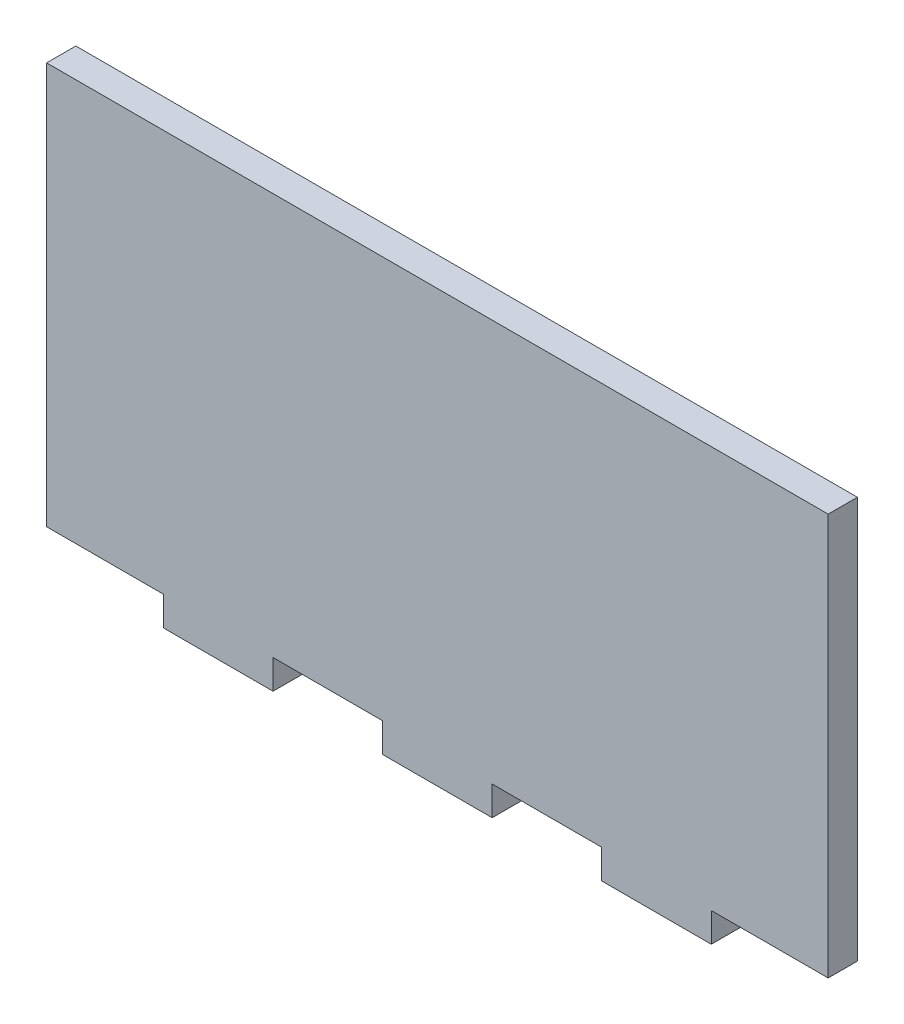
ISO-10303-21;
HEADER;
FILE_DESCRIPTION(('STEP AP214'),'2;1');
FILE_NAME('part.step','',(''),(''),'','','');
FILE_SCHEMA(('AUTOMOTIVE_DESIGN { 1 0 10303 214 1 1 1 1 }'));
ENDSEC;
DATA;
#1=APPLICATION_CONTEXT('core data for automotive mechanical design processes');
#2=APPLICATION_PROTOCOL_DEFINITION('international standard','automotive_design',2000,#1);
#3=PRODUCT_CONTEXT('',#1,'mechanical');
#4=PRODUCT('Part','Part','',(#3));
#5=PRODUCT_RELATED_PRODUCT_CATEGORY('part','',(#4));
#6=PRODUCT_DEFINITION_FORMATION('','',#4);
#7=PRODUCT_DEFINITION_CONTEXT('part definition',#1,'design');
#8=PRODUCT_DEFINITION('design','',#6,#7);
#9=PRODUCT_DEFINITION_SHAPE('','',#8);
#10=(LENGTH_UNIT() NAMED_UNIT(*) SI_UNIT(.MILLI.,.METRE.));
#11=(NAMED_UNIT(*) PLANE_ANGLE_UNIT() SI_UNIT($,.RADIAN.));
#12=(NAMED_UNIT(*) SI_UNIT($,.STERADIAN.) SOLID_ANGLE_UNIT());
#13=UNCERTAINTY_MEASURE_WITH_UNIT(LENGTH_MEASURE(1.E-05),#10,'distance_accuracy_value','');
#14=(GEOMETRIC_REPRESENTATION_CONTEXT(3) GLOBAL_UNCERTAINTY_ASSIGNED_CONTEXT((#13)) GLOBAL_UNIT_ASSIGNED_CONTEXT((#10,
#11,#12)) REPRESENTATION_CONTEXT('',''));
#15=CARTESIAN_POINT('',(0.,0.,0.));
#16=DIRECTION('',(0.,0.,1.));
#17=DIRECTION('',(1.,0.,0.));
#18=AXIS2_PLACEMENT_3D('',#15,#16,#17);
#19=CARTESIAN_POINT('',(0.,0.,0.));
#20=DIRECTION('',(0.,-1.,0.));
#21=DIRECTION('',(0.,0.,-1.));
#22=AXIS2_PLACEMENT_3D('',#19,#20,#21);
#23=PLANE('',#22);
#24=DIRECTION('',(1.,0.,0.));
#25=VECTOR('',#24,1.);
#26=CARTESIAN_POINT('',(-53.5,0.,2.));
#27=LINE('',#26,#25);
#28=CARTESIAN_POINT('',(37.5,0.,2.));
#29=VERTEX_POINT('',#28);
#30=CARTESIAN_POINT('',(53.5,0.,2.));
#31=VERTEX_POINT('',#30);
#32=EDGE_CURVE('E204',#29,#31,#27,.T.);
#33=ORIENTED_EDGE('',*,*,#32,.F.);
#34=DIRECTION('',(0.,0.,1.));
#35=VECTOR('',#34,1.);
#36=CARTESIAN_POINT('',(37.5,0.,2.));
#37=LINE('',#36,#35);
#38=CARTESIAN_POINT('',(37.5,0.,-2.));
#39=VERTEX_POINT('',#38);
#40=EDGE_CURVE('E173',#39,#29,#37,.T.);
#41=ORIENTED_EDGE('',*,*,#40,.F.);
#42=DIRECTION('',(-1.,0.,0.));
#43=VECTOR('',#42,1.);
#44=CARTESIAN_POINT('',(-53.5,0.,-2.));
#45=LINE('',#44,#43);
#46=CARTESIAN_POINT('',(53.5,0.,-2.));
#47=VERTEX_POINT('',#46);
#48=EDGE_CURVE('E191',#47,#39,#45,.T.);
#49=ORIENTED_EDGE('',*,*,#48,.F.);
#50=DIRECTION('',(0.,0.,-1.));
#51=VECTOR('',#50,1.);
#52=CARTESIAN_POINT('',(53.5,0.,2.));
#53=LINE('',#52,#51);
#54=EDGE_CURVE('E200',#31,#47,#53,.T.);
#55=ORIENTED_EDGE('',*,*,#54,.F.);
#56=EDGE_LOOP('',(#33,#41,#49,#55));
#57=FACE_BOUND('',#56,.T.);
#58=ADVANCED_FACE('F45',(#57),#23,.T.);
#59=CARTESIAN_POINT('',(22.5,0.,-2.));
#60=VERTEX_POINT('',#59);
#61=CARTESIAN_POINT('',(7.49999999999999,0.,-2.));
#62=VERTEX_POINT('',#61);
#63=EDGE_CURVE('E180',#60,#62,#45,.T.);
#64=ORIENTED_EDGE('',*,*,#63,.F.);
#65=DIRECTION('',(0.,0.,-1.));
#66=VECTOR('',#65,1.);
#67=CARTESIAN_POINT('',(22.5,0.,-2.));
#68=LINE('',#67,#66);
#69=CARTESIAN_POINT('',(22.5,0.,2.));
#70=VERTEX_POINT('',#69);
#71=EDGE_CURVE('E161',#70,#60,#68,.T.);
#72=ORIENTED_EDGE('',*,*,#71,.F.);
#73=CARTESIAN_POINT('',(7.49999999999999,0.,2.));
#74=VERTEX_POINT('',#73);
#75=EDGE_CURVE('E356',#74,#70,#27,.T.);
#76=ORIENTED_EDGE('',*,*,#75,.F.);
#77=DIRECTION('',(0.,0.,1.));
#78=VECTOR('',#77,1.);
#79=CARTESIAN_POINT('',(7.49999999999999,0.,2.));
#80=LINE('',#79,#78);
#81=EDGE_CURVE('E189',#62,#74,#80,.T.);
#82=ORIENTED_EDGE('',*,*,#81,.F.);
#83=EDGE_LOOP('',(#64,#72,#76,#82));
#84=FACE_BOUND('',#83,.T.);
#85=ADVANCED_FACE('F188',(#84),#23,.T.);
#86=CARTESIAN_POINT('',(-7.50000000000001,0.,-2.));
#87=VERTEX_POINT('',#86);
#88=CARTESIAN_POINT('',(-22.5,0.,-2.));
#89=VERTEX_POINT('',#88);
#90=EDGE_CURVE('E192',#87,#89,#45,.T.);
#91=ORIENTED_EDGE('',*,*,#90,.F.);
#92=DIRECTION('',(0.,0.,-1.));
#93=VECTOR('',#92,1.);
#94=CARTESIAN_POINT('',(-7.50000000000001,0.,-2.));
#95=LINE('',#94,#93);
#96=CARTESIAN_POINT('',(-7.50000000000001,0.,2.));
#97=VERTEX_POINT('',#96);
#98=EDGE_CURVE('E301',#97,#87,#95,.T.);
#99=ORIENTED_EDGE('',*,*,#98,.F.);
#100=CARTESIAN_POINT('',(-22.5,0.,2.));
#101=VERTEX_POINT('',#100);
#102=EDGE_CURVE('E210',#101,#97,#27,.T.);
#103=ORIENTED_EDGE('',*,*,#102,.F.);
#104=DIRECTION('',(0.,0.,1.));
#105=VECTOR('',#104,1.);
#106=CARTESIAN_POINT('',(-22.5,0.,-2.));
#107=LINE('',#106,#105);
#108=EDGE_CURVE('E321',#89,#101,#107,.T.);
#109=ORIENTED_EDGE('',*,*,#108,.F.);
#110=EDGE_LOOP('',(#91,#99,#103,#109));
#111=FACE_BOUND('',#110,.T.);
#112=ADVANCED_FACE('F352',(#111),#23,.T.);
#113=CARTESIAN_POINT('',(53.5,55.,2.));
#114=DIRECTION('',(-1.,0.,0.));
#115=DIRECTION('',(0.,0.,1.));
#116=AXIS2_PLACEMENT_3D('',#113,#114,#115);
#117=PLANE('',#116);
#118=ORIENTED_EDGE('',*,*,#54,.T.);
#119=DIRECTION('',(0.,-1.,0.));
#120=VECTOR('',#119,1.);
#121=CARTESIAN_POINT('',(53.5,55.,-2.));
#122=LINE('',#121,#120);
#123=CARTESIAN_POINT('',(53.5,55.,-2.));
#124=VERTEX_POINT('',#123);
#125=EDGE_CURVE('E11',#124,#47,#122,.T.);
#126=ORIENTED_EDGE('',*,*,#125,.F.);
#127=DIRECTION('',(0.,0.,-1.));
#128=VECTOR('',#127,1.);
#129=CARTESIAN_POINT('',(53.5,55.,2.));
#130=LINE('',#129,#128);
#131=CARTESIAN_POINT('',(53.5,55.,2.));
#132=VERTEX_POINT('',#131);
#133=EDGE_CURVE('E209',#132,#124,#130,.T.);
#134=ORIENTED_EDGE('',*,*,#133,.F.);
#135=DIRECTION('',(0.,-1.,0.));
#136=VECTOR('',#135,1.);
#137=CARTESIAN_POINT('',(53.5,55.,2.));
#138=LINE('',#137,#136);
#139=EDGE_CURVE('E211',#132,#31,#138,.T.);
#140=ORIENTED_EDGE('',*,*,#139,.T.);
#141=EDGE_LOOP('',(#118,#126,#134,#140));
#142=FACE_BOUND('',#141,.T.);
#143=ADVANCED_FACE('F47',(#142),#117,.F.);
#144=CARTESIAN_POINT('',(-53.5,55.,-2.));
#145=DIRECTION('',(0.,0.,1.));
#146=DIRECTION('',(1.,0.,0.));
#147=AXIS2_PLACEMENT_3D('',#144,#145,#146);
#148=PLANE('',#147);
#149=ORIENTED_EDGE('',*,*,#48,.T.);
#150=DIRECTION('',(0.,1.,0.));
#151=VECTOR('',#150,1.);
#152=CARTESIAN_POINT('',(37.5,-4.,-2.));
#153=LINE('',#152,#151);
#154=CARTESIAN_POINT('',(37.5,-4.,-2.));
#155=VERTEX_POINT('',#154);
#156=EDGE_CURVE('E271',#155,#39,#153,.T.);
#157=ORIENTED_EDGE('',*,*,#156,.F.);
#158=DIRECTION('',(1.,0.,0.));
#159=VECTOR('',#158,1.);
#160=CARTESIAN_POINT('',(37.5,-4.,-2.));
#161=LINE('',#160,#159);
#162=CARTESIAN_POINT('',(22.5,-4.,-2.));
#163=VERTEX_POINT('',#162);
#164=EDGE_CURVE('E174',#163,#155,#161,.T.);
#165=ORIENTED_EDGE('',*,*,#164,.F.);
#166=DIRECTION('',(0.,1.,0.));
#167=VECTOR('',#166,1.);
#168=CARTESIAN_POINT('',(22.5,-4.,-2.));
#169=LINE('',#168,#167);
#170=EDGE_CURVE('E165',#163,#60,#169,.T.);
#171=ORIENTED_EDGE('',*,*,#170,.T.);
#172=ORIENTED_EDGE('',*,*,#63,.T.);
#173=DIRECTION('',(0.,1.,0.));
#174=VECTOR('',#173,1.);
#175=CARTESIAN_POINT('',(7.49999999999999,-4.,-2.));
#176=LINE('',#175,#174);
#177=CARTESIAN_POINT('',(7.49999999999999,-4.,-2.));
#178=VERTEX_POINT('',#177);
#179=EDGE_CURVE('E276',#178,#62,#176,.T.);
#180=ORIENTED_EDGE('',*,*,#179,.F.);
#181=DIRECTION('',(1.,0.,0.));
#182=VECTOR('',#181,1.);
#183=CARTESIAN_POINT('',(7.49999999999999,-4.,-2.));
#184=LINE('',#183,#182);
#185=CARTESIAN_POINT('',(-7.50000000000001,-4.,-2.));
#186=VERTEX_POINT('',#185);
#187=EDGE_CURVE('E304',#186,#178,#184,.T.);
#188=ORIENTED_EDGE('',*,*,#187,.F.);
#189=DIRECTION('',(0.,1.,0.));
#190=VECTOR('',#189,1.);
#191=CARTESIAN_POINT('',(-7.50000000000001,-4.,-2.));
#192=LINE('',#191,#190);
#193=EDGE_CURVE('E296',#186,#87,#192,.T.);
#194=ORIENTED_EDGE('',*,*,#193,.T.);
#195=ORIENTED_EDGE('',*,*,#90,.T.);
#196=DIRECTION('',(0.,1.,0.));
#197=VECTOR('',#196,1.);
#198=CARTESIAN_POINT('',(-22.5,-4.,-2.));
#199=LINE('',#198,#197);
#200=CARTESIAN_POINT('',(-22.5,-4.,-2.));
#201=VERTEX_POINT('',#200);
#202=EDGE_CURVE('E251',#201,#89,#199,.T.);
#203=ORIENTED_EDGE('',*,*,#202,.F.);
#204=DIRECTION('',(1.,0.,0.));
#205=VECTOR('',#204,1.);
#206=CARTESIAN_POINT('',(-37.5,-4.,-2.));
#207=LINE('',#206,#205);
#208=CARTESIAN_POINT('',(-37.5,-4.,-2.));
#209=VERTEX_POINT('',#208);
#210=EDGE_CURVE('E324',#209,#201,#207,.T.);
#211=ORIENTED_EDGE('',*,*,#210,.F.);
#212=DIRECTION('',(0.,1.,0.));
#213=VECTOR('',#212,1.);
#214=CARTESIAN_POINT('',(-37.5,-4.,-2.));
#215=LINE('',#214,#213);
#216=CARTESIAN_POINT('',(-37.5,0.,-2.));
#217=VERTEX_POINT('',#216);
#218=EDGE_CURVE('E246',#209,#217,#215,.T.);
#219=ORIENTED_EDGE('',*,*,#218,.T.);
#220=CARTESIAN_POINT('',(-53.5,0.,-2.));
#221=VERTEX_POINT('',#220);
#222=EDGE_CURVE('E197',#217,#221,#45,.T.);
#223=ORIENTED_EDGE('',*,*,#222,.T.);
#224=DIRECTION('',(0.,-1.,0.));
#225=VECTOR('',#224,1.);
#226=CARTESIAN_POINT('',(-53.5,55.,-2.));
#227=LINE('',#226,#225);
#228=CARTESIAN_POINT('',(-53.5,55.,-2.));
#229=VERTEX_POINT('',#228);
#230=EDGE_CURVE('E54',#229,#221,#227,.T.);
#231=ORIENTED_EDGE('',*,*,#230,.F.);
#232=DIRECTION('',(-1.,0.,0.));
#233=VECTOR('',#232,1.);
#234=CARTESIAN_POINT('',(-53.5,55.,-2.));
#235=LINE('',#234,#233);
#236=EDGE_CURVE('E258',#124,#229,#235,.T.);
#237=ORIENTED_EDGE('',*,*,#236,.F.);
#238=ORIENTED_EDGE('',*,*,#125,.T.);
#239=EDGE_LOOP('',(#149,#157,#165,#171,#172,#180,#188,#194,#195,#203,#211,#219,#223,#231,#237,#238));
#240=FACE_BOUND('',#239,.T.);
#241=ADVANCED_FACE('F178',(#240),#148,.F.);
#242=CARTESIAN_POINT('',(-53.5,55.,2.));
#243=DIRECTION('',(1.,0.,0.));
#244=DIRECTION('',(0.,0.,-1.));
#245=AXIS2_PLACEMENT_3D('',#242,#243,#244);
#246=PLANE('',#245);
#247=DIRECTION('',(0.,0.,1.));
#248=VECTOR('',#247,1.);
#249=CARTESIAN_POINT('',(-53.5,0.,2.));
#250=LINE('',#249,#248);
#251=CARTESIAN_POINT('',(-53.5,0.,2.));
#252=VERTEX_POINT('',#251);
#253=EDGE_CURVE('E196',#221,#252,#250,.T.);
#254=ORIENTED_EDGE('',*,*,#253,.T.);
#255=DIRECTION('',(0.,-1.,0.));
#256=VECTOR('',#255,1.);
#257=CARTESIAN_POINT('',(-53.5,55.,2.));
#258=LINE('',#257,#256);
#259=CARTESIAN_POINT('',(-53.5,55.,2.));
#260=VERTEX_POINT('',#259);
#261=EDGE_CURVE('E215',#260,#252,#258,.T.);
#262=ORIENTED_EDGE('',*,*,#261,.F.);
#263=DIRECTION('',(0.,0.,1.));
#264=VECTOR('',#263,1.);
#265=CARTESIAN_POINT('',(-53.5,55.,2.));
#266=LINE('',#265,#264);
#267=EDGE_CURVE('E227',#229,#260,#266,.T.);
#268=ORIENTED_EDGE('',*,*,#267,.F.);
#269=ORIENTED_EDGE('',*,*,#230,.T.);
#270=EDGE_LOOP('',(#254,#262,#268,#269));
#271=FACE_BOUND('',#270,.T.);
#272=ADVANCED_FACE('F225',(#271),#246,.F.);
#273=CARTESIAN_POINT('',(-53.5,55.,2.));
#274=DIRECTION('',(0.,0.,-1.));
#275=DIRECTION('',(-1.,0.,0.));
#276=AXIS2_PLACEMENT_3D('',#273,#274,#275);
#277=PLANE('',#276);
#278=CARTESIAN_POINT('',(-37.5,0.,2.));
#279=VERTEX_POINT('',#278);
#280=EDGE_CURVE('E205',#252,#279,#27,.T.);
#281=ORIENTED_EDGE('',*,*,#280,.T.);
#282=DIRECTION('',(0.,1.,0.));
#283=VECTOR('',#282,1.);
#284=CARTESIAN_POINT('',(-37.5,-4.,2.));
#285=LINE('',#284,#283);
#286=CARTESIAN_POINT('',(-37.5,-4.,2.));
#287=VERTEX_POINT('',#286);
#288=EDGE_CURVE('E237',#287,#279,#285,.T.);
#289=ORIENTED_EDGE('',*,*,#288,.F.);
#290=DIRECTION('',(-1.,0.,0.));
#291=VECTOR('',#290,1.);
#292=CARTESIAN_POINT('',(-22.5,-4.,2.));
#293=LINE('',#292,#291);
#294=CARTESIAN_POINT('',(-22.5,-4.,2.));
#295=VERTEX_POINT('',#294);
#296=EDGE_CURVE('E318',#295,#287,#293,.T.);
#297=ORIENTED_EDGE('',*,*,#296,.F.);
#298=DIRECTION('',(0.,1.,0.));
#299=VECTOR('',#298,1.);
#300=CARTESIAN_POINT('',(-22.5,-4.,2.));
#301=LINE('',#300,#299);
#302=EDGE_CURVE('E330',#295,#101,#301,.T.);
#303=ORIENTED_EDGE('',*,*,#302,.T.);
#304=ORIENTED_EDGE('',*,*,#102,.T.);
#305=DIRECTION('',(0.,1.,0.));
#306=VECTOR('',#305,1.);
#307=CARTESIAN_POINT('',(-7.50000000000001,-4.,2.));
#308=LINE('',#307,#306);
#309=CARTESIAN_POINT('',(-7.50000000000001,-4.,2.));
#310=VERTEX_POINT('',#309);
#311=EDGE_CURVE('E293',#310,#97,#308,.T.);
#312=ORIENTED_EDGE('',*,*,#311,.F.);
#313=DIRECTION('',(-1.,0.,0.));
#314=VECTOR('',#313,1.);
#315=CARTESIAN_POINT('',(-7.50000000000001,-4.,2.));
#316=LINE('',#315,#314);
#317=CARTESIAN_POINT('',(7.49999999999999,-4.,2.));
#318=VERTEX_POINT('',#317);
#319=EDGE_CURVE('E309',#318,#310,#316,.T.);
#320=ORIENTED_EDGE('',*,*,#319,.F.);
#321=DIRECTION('',(0.,1.,0.));
#322=VECTOR('',#321,1.);
#323=CARTESIAN_POINT('',(7.49999999999999,-4.,2.));
#324=LINE('',#323,#322);
#325=EDGE_CURVE('E68',#318,#74,#324,.T.);
#326=ORIENTED_EDGE('',*,*,#325,.T.);
#327=ORIENTED_EDGE('',*,*,#75,.T.);
#328=DIRECTION('',(0.,1.,0.));
#329=VECTOR('',#328,1.);
#330=CARTESIAN_POINT('',(22.5,-4.,2.));
#331=LINE('',#330,#329);
#332=CARTESIAN_POINT('',(22.5,-4.,2.));
#333=VERTEX_POINT('',#332);
#334=EDGE_CURVE('E168',#333,#70,#331,.T.);
#335=ORIENTED_EDGE('',*,*,#334,.F.);
#336=DIRECTION('',(-1.,0.,0.));
#337=VECTOR('',#336,1.);
#338=CARTESIAN_POINT('',(22.5,-4.,2.));
#339=LINE('',#338,#337);
#340=CARTESIAN_POINT('',(37.5,-4.,2.));
#341=VERTEX_POINT('',#340);
#342=EDGE_CURVE('E283',#341,#333,#339,.T.);
#343=ORIENTED_EDGE('',*,*,#342,.F.);
#344=DIRECTION('',(0.,1.,0.));
#345=VECTOR('',#344,1.);
#346=CARTESIAN_POINT('',(37.5,-4.,2.));
#347=LINE('',#346,#345);
#348=EDGE_CURVE('E61',#341,#29,#347,.T.);
#349=ORIENTED_EDGE('',*,*,#348,.T.);
#350=ORIENTED_EDGE('',*,*,#32,.T.);
#351=ORIENTED_EDGE('',*,*,#139,.F.);
#352=DIRECTION('',(1.,0.,0.));
#353=VECTOR('',#352,1.);
#354=CARTESIAN_POINT('',(-53.5,55.,2.));
#355=LINE('',#354,#353);
#356=EDGE_CURVE('E216',#260,#132,#355,.T.);
#357=ORIENTED_EDGE('',*,*,#356,.F.);
#358=ORIENTED_EDGE('',*,*,#261,.T.);
#359=EDGE_LOOP('',(#281,#289,#297,#303,#304,#312,#320,#326,#327,#335,#343,#349,#350,#351,#357,#358));
#360=FACE_BOUND('',#359,.T.);
#361=ADVANCED_FACE('F235',(#360),#277,.F.);
#362=CARTESIAN_POINT('',(0.,55.,0.));
#363=DIRECTION('',(0.,-1.,0.));
#364=DIRECTION('',(0.,0.,-1.));
#365=AXIS2_PLACEMENT_3D('',#362,#363,#364);
#366=PLANE('',#365);
#367=ORIENTED_EDGE('',*,*,#133,.T.);
#368=ORIENTED_EDGE('',*,*,#236,.T.);
#369=ORIENTED_EDGE('',*,*,#267,.T.);
#370=ORIENTED_EDGE('',*,*,#356,.T.);
#371=EDGE_LOOP('',(#367,#368,#369,#370));
#372=FACE_BOUND('',#371,.T.);
#373=ADVANCED_FACE('F265',(#372),#366,.F.);
#374=DIRECTION('',(0.,0.,-1.));
#375=VECTOR('',#374,1.);
#376=CARTESIAN_POINT('',(-37.5,0.,2.));
#377=LINE('',#376,#375);
#378=EDGE_CURVE('E232',#279,#217,#377,.T.);
#379=ORIENTED_EDGE('',*,*,#378,.F.);
#380=ORIENTED_EDGE('',*,*,#280,.F.);
#381=ORIENTED_EDGE('',*,*,#253,.F.);
#382=ORIENTED_EDGE('',*,*,#222,.F.);
#383=EDGE_LOOP('',(#379,#380,#381,#382));
#384=FACE_BOUND('',#383,.T.);
#385=ADVANCED_FACE('F230',(#384),#23,.T.);
#386=CARTESIAN_POINT('',(-37.5,-4.,2.));
#387=DIRECTION('',(1.,0.,0.));
#388=DIRECTION('',(0.,0.,-1.));
#389=AXIS2_PLACEMENT_3D('',#386,#387,#388);
#390=PLANE('',#389);
#391=ORIENTED_EDGE('',*,*,#378,.T.);
#392=ORIENTED_EDGE('',*,*,#218,.F.);
#393=DIRECTION('',(0.,0.,-1.));
#394=VECTOR('',#393,1.);
#395=CARTESIAN_POINT('',(-37.5,-4.,2.));
#396=LINE('',#395,#394);
#397=EDGE_CURVE('E243',#287,#209,#396,.T.);
#398=ORIENTED_EDGE('',*,*,#397,.F.);
#399=ORIENTED_EDGE('',*,*,#288,.T.);
#400=EDGE_LOOP('',(#391,#392,#398,#399));
#401=FACE_BOUND('',#400,.T.);
#402=ADVANCED_FACE('F240',(#401),#390,.F.);
#403=CARTESIAN_POINT('',(-22.5,-4.,-2.));
#404=DIRECTION('',(-1.,0.,0.));
#405=DIRECTION('',(0.,0.,1.));
#406=AXIS2_PLACEMENT_3D('',#403,#404,#405);
#407=PLANE('',#406);
#408=ORIENTED_EDGE('',*,*,#108,.T.);
#409=ORIENTED_EDGE('',*,*,#302,.F.);
#410=DIRECTION('',(0.,0.,1.));
#411=VECTOR('',#410,1.);
#412=CARTESIAN_POINT('',(-22.5,-4.,-2.));
#413=LINE('',#412,#411);
#414=EDGE_CURVE('E327',#201,#295,#413,.T.);
#415=ORIENTED_EDGE('',*,*,#414,.F.);
#416=ORIENTED_EDGE('',*,*,#202,.T.);
#417=EDGE_LOOP('',(#408,#409,#415,#416));
#418=FACE_BOUND('',#417,.T.);
#419=ADVANCED_FACE('F343',(#418),#407,.F.);
#420=CARTESIAN_POINT('',(0.,-4.,0.));
#421=DIRECTION('',(0.,-1.,0.));
#422=DIRECTION('',(0.,0.,-1.));
#423=AXIS2_PLACEMENT_3D('',#420,#421,#422);
#424=PLANE('',#423);
#425=ORIENTED_EDGE('',*,*,#296,.T.);
#426=ORIENTED_EDGE('',*,*,#397,.T.);
#427=ORIENTED_EDGE('',*,*,#210,.T.);
#428=ORIENTED_EDGE('',*,*,#414,.T.);
#429=EDGE_LOOP('',(#425,#426,#427,#428));
#430=FACE_BOUND('',#429,.T.);
#431=ADVANCED_FACE('F424',(#430),#424,.T.);
#432=CARTESIAN_POINT('',(7.49999999999999,-4.,2.));
#433=DIRECTION('',(-1.,0.,0.));
#434=DIRECTION('',(0.,0.,1.));
#435=AXIS2_PLACEMENT_3D('',#432,#433,#434);
#436=PLANE('',#435);
#437=ORIENTED_EDGE('',*,*,#81,.T.);
#438=ORIENTED_EDGE('',*,*,#325,.F.);
#439=DIRECTION('',(0.,0.,1.));
#440=VECTOR('',#439,1.);
#441=CARTESIAN_POINT('',(7.49999999999999,-4.,2.));
#442=LINE('',#441,#440);
#443=EDGE_CURVE('E312',#178,#318,#442,.T.);
#444=ORIENTED_EDGE('',*,*,#443,.F.);
#445=ORIENTED_EDGE('',*,*,#179,.T.);
#446=EDGE_LOOP('',(#437,#438,#444,#445));
#447=FACE_BOUND('',#446,.T.);
#448=ADVANCED_FACE('F433',(#447),#436,.F.);
#449=CARTESIAN_POINT('',(-7.50000000000001,-4.,-2.));
#450=DIRECTION('',(1.,0.,0.));
#451=DIRECTION('',(0.,0.,-1.));
#452=AXIS2_PLACEMENT_3D('',#449,#450,#451);
#453=PLANE('',#452);
#454=ORIENTED_EDGE('',*,*,#98,.T.);
#455=ORIENTED_EDGE('',*,*,#193,.F.);
#456=DIRECTION('',(0.,0.,-1.));
#457=VECTOR('',#456,1.);
#458=CARTESIAN_POINT('',(-7.50000000000001,-4.,-2.));
#459=LINE('',#458,#457);
#460=EDGE_CURVE('E300',#310,#186,#459,.T.);
#461=ORIENTED_EDGE('',*,*,#460,.F.);
#462=ORIENTED_EDGE('',*,*,#311,.T.);
#463=EDGE_LOOP('',(#454,#455,#461,#462));
#464=FACE_BOUND('',#463,.T.);
#465=ADVANCED_FACE('F376',(#464),#453,.F.);
#466=CARTESIAN_POINT('',(0.,-4.,0.));
#467=DIRECTION('',(0.,1.,0.));
#468=DIRECTION('',(0.,0.,1.));
#469=AXIS2_PLACEMENT_3D('',#466,#467,#468);
#470=PLANE('',#469);
#471=ORIENTED_EDGE('',*,*,#187,.T.);
#472=ORIENTED_EDGE('',*,*,#443,.T.);
#473=ORIENTED_EDGE('',*,*,#319,.T.);
#474=ORIENTED_EDGE('',*,*,#460,.T.);
#475=EDGE_LOOP('',(#471,#472,#473,#474));
#476=FACE_BOUND('',#475,.T.);
#477=ADVANCED_FACE('F369',(#476),#470,.F.);
#478=CARTESIAN_POINT('',(37.5,-4.,2.));
#479=DIRECTION('',(-1.,0.,0.));
#480=DIRECTION('',(0.,0.,1.));
#481=AXIS2_PLACEMENT_3D('',#478,#479,#480);
#482=PLANE('',#481);
#483=ORIENTED_EDGE('',*,*,#40,.T.);
#484=ORIENTED_EDGE('',*,*,#348,.F.);
#485=DIRECTION('',(0.,0.,1.));
#486=VECTOR('',#485,1.);
#487=CARTESIAN_POINT('',(37.5,-4.,2.));
#488=LINE('',#487,#486);
#489=EDGE_CURVE('E286',#155,#341,#488,.T.);
#490=ORIENTED_EDGE('',*,*,#489,.F.);
#491=ORIENTED_EDGE('',*,*,#156,.T.);
#492=EDGE_LOOP('',(#483,#484,#490,#491));
#493=FACE_BOUND('',#492,.T.);
#494=ADVANCED_FACE('F363',(#493),#482,.F.);
#495=CARTESIAN_POINT('',(22.5,-4.,-2.));
#496=DIRECTION('',(1.,0.,0.));
#497=DIRECTION('',(0.,0.,-1.));
#498=AXIS2_PLACEMENT_3D('',#495,#496,#497);
#499=PLANE('',#498);
#500=ORIENTED_EDGE('',*,*,#71,.T.);
#501=ORIENTED_EDGE('',*,*,#170,.F.);
#502=DIRECTION('',(0.,0.,-1.));
#503=VECTOR('',#502,1.);
#504=CARTESIAN_POINT('',(22.5,-4.,-2.));
#505=LINE('',#504,#503);
#506=EDGE_CURVE('E185',#333,#163,#505,.T.);
#507=ORIENTED_EDGE('',*,*,#506,.F.);
#508=ORIENTED_EDGE('',*,*,#334,.T.);
#509=EDGE_LOOP('',(#500,#501,#507,#508));
#510=FACE_BOUND('',#509,.T.);
#511=ADVANCED_FACE('F163',(#510),#499,.F.);
#512=CARTESIAN_POINT('',(0.,-4.,0.));
#513=DIRECTION('',(0.,1.,0.));
#514=DIRECTION('',(0.,0.,1.));
#515=AXIS2_PLACEMENT_3D('',#512,#513,#514);
#516=PLANE('',#515);
#517=ORIENTED_EDGE('',*,*,#164,.T.);
#518=ORIENTED_EDGE('',*,*,#489,.T.);
#519=ORIENTED_EDGE('',*,*,#342,.T.);
#520=ORIENTED_EDGE('',*,*,#506,.T.);
#521=EDGE_LOOP('',(#517,#518,#519,#520));
#522=FACE_BOUND('',#521,.T.);
#523=ADVANCED_FACE('F362',(#522),#516,.F.);
#524=CLOSED_SHELL('',(#58,#85,#112,#143,#241,#272,#361,#373,#385,#402,#419,#431,#448,#465,#477,
#494,#511,#523));
#525=MANIFOLD_SOLID_BREP('B2',#524);
#526=ADVANCED_BREP_SHAPE_REPRESENTATION('',(#18,#525),#14);
#527=SHAPE_DEFINITION_REPRESENTATION(#9,#526);
ENDSEC;
END-ISO-10303-21;
